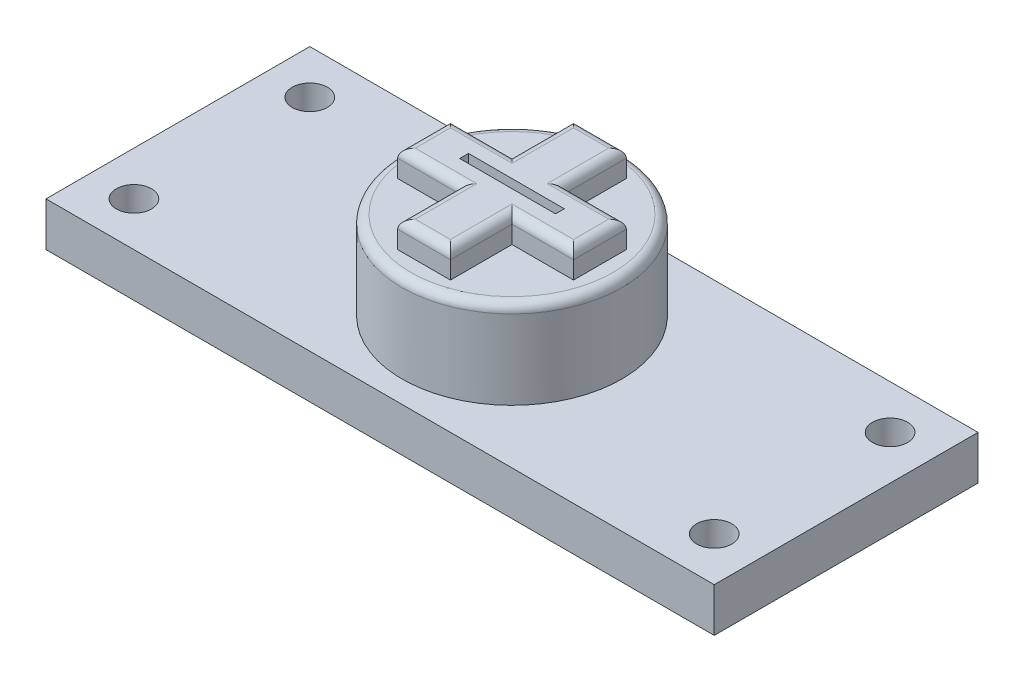
ISO-10303-21;
HEADER;
FILE_DESCRIPTION(('STEP AP214'),'2;1');
FILE_NAME('part.step','',(''),(''),'','','');
FILE_SCHEMA(('AUTOMOTIVE_DESIGN { 1 0 10303 214 1 1 1 1 }'));
ENDSEC;
DATA;
#1=APPLICATION_CONTEXT('core data for automotive mechanical design processes');
#2=APPLICATION_PROTOCOL_DEFINITION('international standard','automotive_design',2000,#1);
#3=PRODUCT_CONTEXT('',#1,'mechanical');
#4=PRODUCT('Part','Part','',(#3));
#5=PRODUCT_RELATED_PRODUCT_CATEGORY('part','',(#4));
#6=PRODUCT_DEFINITION_FORMATION('','',#4);
#7=PRODUCT_DEFINITION_CONTEXT('part definition',#1,'design');
#8=PRODUCT_DEFINITION('design','',#6,#7);
#9=PRODUCT_DEFINITION_SHAPE('','',#8);
#10=(LENGTH_UNIT() NAMED_UNIT(*) SI_UNIT(.MILLI.,.METRE.));
#11=(NAMED_UNIT(*) PLANE_ANGLE_UNIT() SI_UNIT($,.RADIAN.));
#12=(NAMED_UNIT(*) SI_UNIT($,.STERADIAN.) SOLID_ANGLE_UNIT());
#13=UNCERTAINTY_MEASURE_WITH_UNIT(LENGTH_MEASURE(1.E-05),#10,'distance_accuracy_value','');
#14=(GEOMETRIC_REPRESENTATION_CONTEXT(3) GLOBAL_UNCERTAINTY_ASSIGNED_CONTEXT((#13)) GLOBAL_UNIT_ASSIGNED_CONTEXT((#10,
#11,#12)) REPRESENTATION_CONTEXT('',''));
#15=CARTESIAN_POINT('',(0.,0.,0.));
#16=DIRECTION('',(0.,0.,1.));
#17=DIRECTION('',(1.,0.,0.));
#18=AXIS2_PLACEMENT_3D('',#15,#16,#17);
#19=CARTESIAN_POINT('',(-3800.,500.,-1500.));
#20=DIRECTION('',(0.,0.,-1.));
#21=DIRECTION('',(-1.,0.,0.));
#22=AXIS2_PLACEMENT_3D('',#19,#20,#21);
#23=PLANE('',#22);
#24=DIRECTION('',(1.,0.,0.));
#25=VECTOR('',#24,1.);
#26=CARTESIAN_POINT('',(-3800.,0.,-1500.));
#27=LINE('',#26,#25);
#28=CARTESIAN_POINT('',(-3800.,0.,-1500.));
#29=VERTEX_POINT('',#28);
#30=CARTESIAN_POINT('',(3800.,0.,-1500.));
#31=VERTEX_POINT('',#30);
#32=EDGE_CURVE('E339',#29,#31,#27,.T.);
#33=ORIENTED_EDGE('',*,*,#32,.F.);
#34=DIRECTION('',(0.,-1.,0.));
#35=VECTOR('',#34,1.);
#36=CARTESIAN_POINT('',(-3800.,500.,-1500.));
#37=LINE('',#36,#35);
#38=CARTESIAN_POINT('',(-3800.,500.,-1500.));
#39=VERTEX_POINT('',#38);
#40=EDGE_CURVE('E350',#39,#29,#37,.T.);
#41=ORIENTED_EDGE('',*,*,#40,.F.);
#42=DIRECTION('',(1.,0.,0.));
#43=VECTOR('',#42,1.);
#44=CARTESIAN_POINT('',(-3800.,500.,-1500.));
#45=LINE('',#44,#43);
#46=CARTESIAN_POINT('',(3800.,500.,-1500.));
#47=VERTEX_POINT('',#46);
#48=EDGE_CURVE('E327',#39,#47,#45,.T.);
#49=ORIENTED_EDGE('',*,*,#48,.T.);
#50=DIRECTION('',(0.,-1.,0.));
#51=VECTOR('',#50,1.);
#52=CARTESIAN_POINT('',(3800.,500.,-1500.));
#53=LINE('',#52,#51);
#54=EDGE_CURVE('E338',#47,#31,#53,.T.);
#55=ORIENTED_EDGE('',*,*,#54,.T.);
#56=EDGE_LOOP('',(#33,#41,#49,#55));
#57=FACE_BOUND('',#56,.T.);
#58=ADVANCED_FACE('F40',(#57),#23,.T.);
#59=CARTESIAN_POINT('',(-3800.,500.,-1500.));
#60=DIRECTION('',(1.,0.,0.));
#61=DIRECTION('',(0.,0.,-1.));
#62=AXIS2_PLACEMENT_3D('',#59,#60,#61);
#63=PLANE('',#62);
#64=DIRECTION('',(0.,0.,1.));
#65=VECTOR('',#64,1.);
#66=CARTESIAN_POINT('',(-3800.,0.,-1500.));
#67=LINE('',#66,#65);
#68=CARTESIAN_POINT('',(-3800.,0.,1500.));
#69=VERTEX_POINT('',#68);
#70=EDGE_CURVE('E331',#29,#69,#67,.T.);
#71=ORIENTED_EDGE('',*,*,#70,.T.);
#72=DIRECTION('',(0.,-1.,0.));
#73=VECTOR('',#72,1.);
#74=CARTESIAN_POINT('',(-3800.,500.,1500.));
#75=LINE('',#74,#73);
#76=CARTESIAN_POINT('',(-3800.,500.,1500.));
#77=VERTEX_POINT('',#76);
#78=EDGE_CURVE('E353',#77,#69,#75,.T.);
#79=ORIENTED_EDGE('',*,*,#78,.F.);
#80=DIRECTION('',(0.,0.,1.));
#81=VECTOR('',#80,1.);
#82=CARTESIAN_POINT('',(-3800.,500.,-1500.));
#83=LINE('',#82,#81);
#84=EDGE_CURVE('E336',#39,#77,#83,.T.);
#85=ORIENTED_EDGE('',*,*,#84,.F.);
#86=ORIENTED_EDGE('',*,*,#40,.T.);
#87=EDGE_LOOP('',(#71,#79,#85,#86));
#88=FACE_BOUND('',#87,.T.);
#89=ADVANCED_FACE('F471',(#88),#63,.F.);
#90=CARTESIAN_POINT('',(-3800.,500.,1500.));
#91=DIRECTION('',(0.,0.,-1.));
#92=DIRECTION('',(-1.,0.,0.));
#93=AXIS2_PLACEMENT_3D('',#90,#91,#92);
#94=PLANE('',#93);
#95=DIRECTION('',(1.,0.,0.));
#96=VECTOR('',#95,1.);
#97=CARTESIAN_POINT('',(-3800.,0.,1500.));
#98=LINE('',#97,#96);
#99=CARTESIAN_POINT('',(3800.,0.,1500.));
#100=VERTEX_POINT('',#99);
#101=EDGE_CURVE('E346',#69,#100,#98,.T.);
#102=ORIENTED_EDGE('',*,*,#101,.T.);
#103=DIRECTION('',(0.,-1.,0.));
#104=VECTOR('',#103,1.);
#105=CARTESIAN_POINT('',(3800.,500.,1500.));
#106=LINE('',#105,#104);
#107=CARTESIAN_POINT('',(3800.,500.,1500.));
#108=VERTEX_POINT('',#107);
#109=EDGE_CURVE('E356',#108,#100,#106,.T.);
#110=ORIENTED_EDGE('',*,*,#109,.F.);
#111=DIRECTION('',(1.,0.,0.));
#112=VECTOR('',#111,1.);
#113=CARTESIAN_POINT('',(-3800.,500.,1500.));
#114=LINE('',#113,#112);
#115=EDGE_CURVE('E334',#77,#108,#114,.T.);
#116=ORIENTED_EDGE('',*,*,#115,.F.);
#117=ORIENTED_EDGE('',*,*,#78,.T.);
#118=EDGE_LOOP('',(#102,#110,#116,#117));
#119=FACE_BOUND('',#118,.T.);
#120=ADVANCED_FACE('F477',(#119),#94,.F.);
#121=CARTESIAN_POINT('',(3800.,500.,-1500.));
#122=DIRECTION('',(1.,0.,0.));
#123=DIRECTION('',(0.,0.,-1.));
#124=AXIS2_PLACEMENT_3D('',#121,#122,#123);
#125=PLANE('',#124);
#126=DIRECTION('',(0.,0.,1.));
#127=VECTOR('',#126,1.);
#128=CARTESIAN_POINT('',(3800.,0.,-1500.));
#129=LINE('',#128,#127);
#130=EDGE_CURVE('E342',#31,#100,#129,.T.);
#131=ORIENTED_EDGE('',*,*,#130,.F.);
#132=ORIENTED_EDGE('',*,*,#54,.F.);
#133=DIRECTION('',(0.,0.,1.));
#134=VECTOR('',#133,1.);
#135=CARTESIAN_POINT('',(3800.,500.,-1500.));
#136=LINE('',#135,#134);
#137=EDGE_CURVE('E330',#47,#108,#136,.T.);
#138=ORIENTED_EDGE('',*,*,#137,.T.);
#139=ORIENTED_EDGE('',*,*,#109,.T.);
#140=EDGE_LOOP('',(#131,#132,#138,#139));
#141=FACE_BOUND('',#140,.T.);
#142=ADVANCED_FACE('F482',(#141),#125,.T.);
#143=CARTESIAN_POINT('',(0.,500.,0.));
#144=DIRECTION('',(0.,-1.,0.));
#145=DIRECTION('',(0.,0.,-1.));
#146=AXIS2_PLACEMENT_3D('',#143,#144,#145);
#147=PLANE('',#146);
#148=CARTESIAN_POINT('',(0.,500.,0.));
#149=DIRECTION('',(0.,-1.,0.));
#150=DIRECTION('',(0.,0.,-1.));
#151=AXIS2_PLACEMENT_3D('',#148,#149,#150);
#152=CIRCLE('',#151,1250.);
#153=CARTESIAN_POINT('',(0.,500.,-1250.));
#154=VERTEX_POINT('',#153);
#155=EDGE_CURVE('E352',#154,#154,#152,.F.);
#156=ORIENTED_EDGE('',*,*,#155,.F.);
#157=EDGE_LOOP('',(#156));
#158=FACE_BOUND('',#157,.T.);
#159=CARTESIAN_POINT('',(3300.,500.,1000.));
#160=DIRECTION('',(0.,1.,0.));
#161=DIRECTION('',(0.,0.,1.));
#162=AXIS2_PLACEMENT_3D('',#159,#160,#161);
#163=CIRCLE('',#162,200.);
#164=CARTESIAN_POINT('',(3300.,500.,1200.));
#165=VERTEX_POINT('',#164);
#166=EDGE_CURVE('E314',#165,#165,#163,.T.);
#167=ORIENTED_EDGE('',*,*,#166,.F.);
#168=EDGE_LOOP('',(#167));
#169=FACE_BOUND('',#168,.T.);
#170=CARTESIAN_POINT('',(3300.,500.,-1000.));
#171=DIRECTION('',(0.,1.,0.));
#172=DIRECTION('',(0.,0.,1.));
#173=AXIS2_PLACEMENT_3D('',#170,#171,#172);
#174=CIRCLE('',#173,200.);
#175=CARTESIAN_POINT('',(3300.,500.,-800.));
#176=VERTEX_POINT('',#175);
#177=EDGE_CURVE('E319',#176,#176,#174,.T.);
#178=ORIENTED_EDGE('',*,*,#177,.F.);
#179=EDGE_LOOP('',(#178));
#180=FACE_BOUND('',#179,.T.);
#181=CARTESIAN_POINT('',(-3300.,500.,-1000.));
#182=DIRECTION('',(0.,1.,0.));
#183=DIRECTION('',(0.,0.,1.));
#184=AXIS2_PLACEMENT_3D('',#181,#182,#183);
#185=CIRCLE('',#184,200.);
#186=CARTESIAN_POINT('',(-3300.,500.,-800.));
#187=VERTEX_POINT('',#186);
#188=EDGE_CURVE('E315',#187,#187,#185,.T.);
#189=ORIENTED_EDGE('',*,*,#188,.F.);
#190=EDGE_LOOP('',(#189));
#191=FACE_BOUND('',#190,.T.);
#192=CARTESIAN_POINT('',(-3300.,500.,1000.));
#193=DIRECTION('',(0.,1.,0.));
#194=DIRECTION('',(0.,0.,1.));
#195=AXIS2_PLACEMENT_3D('',#192,#193,#194);
#196=CIRCLE('',#195,200.);
#197=CARTESIAN_POINT('',(-3300.,500.,1200.));
#198=VERTEX_POINT('',#197);
#199=EDGE_CURVE('E318',#198,#198,#196,.T.);
#200=ORIENTED_EDGE('',*,*,#199,.F.);
#201=EDGE_LOOP('',(#200));
#202=FACE_BOUND('',#201,.T.);
#203=ORIENTED_EDGE('',*,*,#48,.F.);
#204=ORIENTED_EDGE('',*,*,#84,.T.);
#205=ORIENTED_EDGE('',*,*,#115,.T.);
#206=ORIENTED_EDGE('',*,*,#137,.F.);
#207=EDGE_LOOP('',(#203,#204,#205,#206));
#208=FACE_BOUND('',#207,.T.);
#209=ADVANCED_FACE('F652',(#158,#169,#180,#191,#202,#208),#147,.F.);
#210=CARTESIAN_POINT('',(0.,0.,0.));
#211=DIRECTION('',(0.,-1.,0.));
#212=DIRECTION('',(0.,0.,-1.));
#213=AXIS2_PLACEMENT_3D('',#210,#211,#212);
#214=PLANE('',#213);
#215=CARTESIAN_POINT('',(3300.,0.,1000.));
#216=DIRECTION('',(0.,-1.,0.));
#217=DIRECTION('',(0.,0.,-1.));
#218=AXIS2_PLACEMENT_3D('',#215,#216,#217);
#219=CIRCLE('',#218,200.);
#220=CARTESIAN_POINT('',(3300.,0.,800.));
#221=VERTEX_POINT('',#220);
#222=EDGE_CURVE('E343',#221,#221,#219,.T.);
#223=ORIENTED_EDGE('',*,*,#222,.F.);
#224=EDGE_LOOP('',(#223));
#225=FACE_BOUND('',#224,.T.);
#226=CARTESIAN_POINT('',(3300.,0.,-1000.));
#227=DIRECTION('',(0.,-1.,0.));
#228=DIRECTION('',(0.,0.,-1.));
#229=AXIS2_PLACEMENT_3D('',#226,#227,#228);
#230=CIRCLE('',#229,200.);
#231=CARTESIAN_POINT('',(3300.,0.,-1200.));
#232=VERTEX_POINT('',#231);
#233=EDGE_CURVE('E364',#232,#232,#230,.T.);
#234=ORIENTED_EDGE('',*,*,#233,.F.);
#235=EDGE_LOOP('',(#234));
#236=FACE_BOUND('',#235,.T.);
#237=CARTESIAN_POINT('',(-3300.,0.,-1000.));
#238=DIRECTION('',(0.,-1.,0.));
#239=DIRECTION('',(0.,0.,-1.));
#240=AXIS2_PLACEMENT_3D('',#237,#238,#239);
#241=CIRCLE('',#240,200.);
#242=CARTESIAN_POINT('',(-3300.,0.,-1200.));
#243=VERTEX_POINT('',#242);
#244=EDGE_CURVE('E361',#243,#243,#241,.T.);
#245=ORIENTED_EDGE('',*,*,#244,.F.);
#246=EDGE_LOOP('',(#245));
#247=FACE_BOUND('',#246,.T.);
#248=CARTESIAN_POINT('',(-3300.,0.,1000.));
#249=DIRECTION('',(0.,-1.,0.));
#250=DIRECTION('',(0.,0.,-1.));
#251=AXIS2_PLACEMENT_3D('',#248,#249,#250);
#252=CIRCLE('',#251,200.);
#253=CARTESIAN_POINT('',(-3300.,0.,800.));
#254=VERTEX_POINT('',#253);
#255=EDGE_CURVE('E326',#254,#254,#252,.T.);
#256=ORIENTED_EDGE('',*,*,#255,.F.);
#257=EDGE_LOOP('',(#256));
#258=FACE_BOUND('',#257,.T.);
#259=ORIENTED_EDGE('',*,*,#32,.T.);
#260=ORIENTED_EDGE('',*,*,#130,.T.);
#261=ORIENTED_EDGE('',*,*,#101,.F.);
#262=ORIENTED_EDGE('',*,*,#70,.F.);
#263=EDGE_LOOP('',(#259,#260,#261,#262));
#264=FACE_BOUND('',#263,.T.);
#265=ADVANCED_FACE('F650',(#225,#236,#247,#258,#264),#214,.T.);
#266=CARTESIAN_POINT('',(-3300.,-500.,1000.));
#267=DIRECTION('',(0.,1.,0.));
#268=DIRECTION('',(0.,0.,1.));
#269=AXIS2_PLACEMENT_3D('',#266,#267,#268);
#270=CYLINDRICAL_SURFACE('',#269,200.);
#271=ORIENTED_EDGE('',*,*,#255,.T.);
#272=EDGE_LOOP('',(#271));
#273=FACE_BOUND('',#272,.T.);
#274=ORIENTED_EDGE('',*,*,#199,.T.);
#275=EDGE_LOOP('',(#274));
#276=FACE_BOUND('',#275,.T.);
#277=ADVANCED_FACE('F640',(#273,#276),#270,.F.);
#278=CARTESIAN_POINT('',(-3300.,-500.,-1000.));
#279=DIRECTION('',(0.,1.,0.));
#280=DIRECTION('',(0.,0.,1.));
#281=AXIS2_PLACEMENT_3D('',#278,#279,#280);
#282=CYLINDRICAL_SURFACE('',#281,200.);
#283=ORIENTED_EDGE('',*,*,#244,.T.);
#284=EDGE_LOOP('',(#283));
#285=FACE_BOUND('',#284,.T.);
#286=ORIENTED_EDGE('',*,*,#188,.T.);
#287=EDGE_LOOP('',(#286));
#288=FACE_BOUND('',#287,.T.);
#289=ADVANCED_FACE('F636',(#285,#288),#282,.F.);
#290=CARTESIAN_POINT('',(3300.,-500.,-1000.));
#291=DIRECTION('',(0.,1.,0.));
#292=DIRECTION('',(0.,0.,1.));
#293=AXIS2_PLACEMENT_3D('',#290,#291,#292);
#294=CYLINDRICAL_SURFACE('',#293,200.);
#295=ORIENTED_EDGE('',*,*,#233,.T.);
#296=EDGE_LOOP('',(#295));
#297=FACE_BOUND('',#296,.T.);
#298=ORIENTED_EDGE('',*,*,#177,.T.);
#299=EDGE_LOOP('',(#298));
#300=FACE_BOUND('',#299,.T.);
#301=ADVANCED_FACE('F639',(#297,#300),#294,.F.);
#302=CARTESIAN_POINT('',(3300.,-500.,1000.));
#303=DIRECTION('',(0.,1.,0.));
#304=DIRECTION('',(0.,0.,1.));
#305=AXIS2_PLACEMENT_3D('',#302,#303,#304);
#306=CYLINDRICAL_SURFACE('',#305,200.);
#307=ORIENTED_EDGE('',*,*,#222,.T.);
#308=EDGE_LOOP('',(#307));
#309=FACE_BOUND('',#308,.T.);
#310=ORIENTED_EDGE('',*,*,#166,.T.);
#311=EDGE_LOOP('',(#310));
#312=FACE_BOUND('',#311,.T.);
#313=ADVANCED_FACE('F634',(#309,#312),#306,.F.);
#314=CARTESIAN_POINT('',(0.,1500.,0.));
#315=DIRECTION('',(0.,-1.,0.));
#316=DIRECTION('',(0.,0.,-1.));
#317=AXIS2_PLACEMENT_3D('',#314,#315,#316);
#318=CYLINDRICAL_SURFACE('',#317,1250.);
#319=CARTESIAN_POINT('',(0.,1400.,0.));
#320=DIRECTION('',(0.,1.,0.));
#321=DIRECTION('',(0.,0.,1.));
#322=AXIS2_PLACEMENT_3D('',#319,#320,#321);
#323=CIRCLE('',#322,1250.);
#324=CARTESIAN_POINT('',(0.,1400.,1250.));
#325=VERTEX_POINT('',#324);
#326=EDGE_CURVE('E11',#325,#325,#323,.F.);
#327=ORIENTED_EDGE('',*,*,#326,.T.);
#328=EDGE_LOOP('',(#327));
#329=FACE_BOUND('',#328,.T.);
#330=ORIENTED_EDGE('',*,*,#155,.T.);
#331=EDGE_LOOP('',(#330));
#332=FACE_BOUND('',#331,.T.);
#333=ADVANCED_FACE('F631',(#329,#332),#318,.T.);
#334=CARTESIAN_POINT('',(0.,1500.,0.));
#335=DIRECTION('',(0.,1.,0.));
#336=DIRECTION('',(0.,0.,1.));
#337=AXIS2_PLACEMENT_3D('',#334,#335,#336);
#338=PLANE('',#337);
#339=CARTESIAN_POINT('',(0.,1500.,0.));
#340=DIRECTION('',(0.,1.,0.));
#341=DIRECTION('',(0.,0.,1.));
#342=AXIS2_PLACEMENT_3D('',#339,#340,#341);
#343=CIRCLE('',#342,1150.);
#344=CARTESIAN_POINT('',(0.,1500.,1150.));
#345=VERTEX_POINT('',#344);
#346=EDGE_CURVE('E48',#345,#345,#343,.T.);
#347=ORIENTED_EDGE('',*,*,#346,.T.);
#348=EDGE_LOOP('',(#347));
#349=FACE_BOUND('',#348,.T.);
#350=DIRECTION('',(0.,0.,-1.));
#351=VECTOR('',#350,1.);
#352=CARTESIAN_POINT('',(300.,1500.,300.));
#353=LINE('',#352,#351);
#354=CARTESIAN_POINT('',(300.,1500.,1000.));
#355=VERTEX_POINT('',#354);
#356=CARTESIAN_POINT('',(300.,1500.,300.));
#357=VERTEX_POINT('',#356);
#358=EDGE_CURVE('E253',#355,#357,#353,.T.);
#359=ORIENTED_EDGE('',*,*,#358,.F.);
#360=DIRECTION('',(1.,0.,0.));
#361=VECTOR('',#360,1.);
#362=CARTESIAN_POINT('',(-300.,1500.,1000.));
#363=LINE('',#362,#361);
#364=CARTESIAN_POINT('',(-300.,1500.,1000.));
#365=VERTEX_POINT('',#364);
#366=EDGE_CURVE('E287',#365,#355,#363,.T.);
#367=ORIENTED_EDGE('',*,*,#366,.F.);
#368=DIRECTION('',(0.,0.,1.));
#369=VECTOR('',#368,1.);
#370=CARTESIAN_POINT('',(-300.,1500.,300.));
#371=LINE('',#370,#369);
#372=CARTESIAN_POINT('',(-300.,1500.,300.));
#373=VERTEX_POINT('',#372);
#374=EDGE_CURVE('E284',#373,#365,#371,.T.);
#375=ORIENTED_EDGE('',*,*,#374,.F.);
#376=DIRECTION('',(1.,0.,0.));
#377=VECTOR('',#376,1.);
#378=CARTESIAN_POINT('',(-300.,1500.,300.));
#379=LINE('',#378,#377);
#380=CARTESIAN_POINT('',(-1000.,1500.,300.000000000001));
#381=VERTEX_POINT('',#380);
#382=EDGE_CURVE('E281',#381,#373,#379,.T.);
#383=ORIENTED_EDGE('',*,*,#382,.F.);
#384=DIRECTION('',(0.,0.,1.));
#385=VECTOR('',#384,1.);
#386=CARTESIAN_POINT('',(-1000.,1500.,300.000000000001));
#387=LINE('',#386,#385);
#388=CARTESIAN_POINT('',(-1000.,1500.,-300.));
#389=VERTEX_POINT('',#388);
#390=EDGE_CURVE('E278',#389,#381,#387,.T.);
#391=ORIENTED_EDGE('',*,*,#390,.F.);
#392=DIRECTION('',(-1.,0.,0.));
#393=VECTOR('',#392,1.);
#394=CARTESIAN_POINT('',(-300.,1500.,-300.));
#395=LINE('',#394,#393);
#396=CARTESIAN_POINT('',(-300.,1500.,-300.));
#397=VERTEX_POINT('',#396);
#398=EDGE_CURVE('E275',#397,#389,#395,.T.);
#399=ORIENTED_EDGE('',*,*,#398,.F.);
#400=DIRECTION('',(0.,0.,1.));
#401=VECTOR('',#400,1.);
#402=CARTESIAN_POINT('',(-300.,1500.,-1000.));
#403=LINE('',#402,#401);
#404=CARTESIAN_POINT('',(-300.,1500.,-1000.));
#405=VERTEX_POINT('',#404);
#406=EDGE_CURVE('E272',#405,#397,#403,.T.);
#407=ORIENTED_EDGE('',*,*,#406,.F.);
#408=DIRECTION('',(-1.,0.,0.));
#409=VECTOR('',#408,1.);
#410=CARTESIAN_POINT('',(-300.,1500.,-1000.));
#411=LINE('',#410,#409);
#412=CARTESIAN_POINT('',(300.,1500.,-1000.));
#413=VERTEX_POINT('',#412);
#414=EDGE_CURVE('E269',#413,#405,#411,.T.);
#415=ORIENTED_EDGE('',*,*,#414,.F.);
#416=DIRECTION('',(0.,0.,-1.));
#417=VECTOR('',#416,1.);
#418=CARTESIAN_POINT('',(300.,1500.,-1000.));
#419=LINE('',#418,#417);
#420=CARTESIAN_POINT('',(300.,1500.,-300.));
#421=VERTEX_POINT('',#420);
#422=EDGE_CURVE('E266',#421,#413,#419,.T.);
#423=ORIENTED_EDGE('',*,*,#422,.F.);
#424=DIRECTION('',(-1.,0.,0.));
#425=VECTOR('',#424,1.);
#426=CARTESIAN_POINT('',(1000.,1500.,-300.));
#427=LINE('',#426,#425);
#428=CARTESIAN_POINT('',(1000.,1500.,-300.));
#429=VERTEX_POINT('',#428);
#430=EDGE_CURVE('E263',#429,#421,#427,.T.);
#431=ORIENTED_EDGE('',*,*,#430,.F.);
#432=DIRECTION('',(0.,0.,-1.));
#433=VECTOR('',#432,1.);
#434=CARTESIAN_POINT('',(1000.,1500.,300.));
#435=LINE('',#434,#433);
#436=CARTESIAN_POINT('',(1000.,1500.,300.));
#437=VERTEX_POINT('',#436);
#438=EDGE_CURVE('E260',#437,#429,#435,.T.);
#439=ORIENTED_EDGE('',*,*,#438,.F.);
#440=DIRECTION('',(1.,0.,0.));
#441=VECTOR('',#440,1.);
#442=CARTESIAN_POINT('',(1000.,1500.,300.));
#443=LINE('',#442,#441);
#444=EDGE_CURVE('E256',#357,#437,#443,.T.);
#445=ORIENTED_EDGE('',*,*,#444,.F.);
#446=EDGE_LOOP('',(#359,#367,#375,#383,#391,#399,#407,#415,#423,#431,#439,#445));
#447=FACE_BOUND('',#446,.T.);
#448=ADVANCED_FACE('F454',(#349,#447),#338,.T.);
#449=CARTESIAN_POINT('',(300.,1800.,300.));
#450=DIRECTION('',(-1.,0.,0.));
#451=DIRECTION('',(0.,0.,1.));
#452=AXIS2_PLACEMENT_3D('',#449,#450,#451);
#453=PLANE('',#452);
#454=DIRECTION('',(0.,-1.,0.));
#455=VECTOR('',#454,1.);
#456=CARTESIAN_POINT('',(300.,1800.,300.));
#457=LINE('',#456,#455);
#458=CARTESIAN_POINT('',(300.,1700.,300.));
#459=VERTEX_POINT('',#458);
#460=EDGE_CURVE('E312',#459,#357,#457,.T.);
#461=ORIENTED_EDGE('',*,*,#460,.F.);
#462=DIRECTION('',(0.,0.,-1.));
#463=VECTOR('',#462,1.);
#464=CARTESIAN_POINT('',(300.,1700.,1000.));
#465=LINE('',#464,#463);
#466=CARTESIAN_POINT('',(300.,1700.,1000.));
#467=VERTEX_POINT('',#466);
#468=EDGE_CURVE('E418',#459,#467,#465,.F.);
#469=ORIENTED_EDGE('',*,*,#468,.T.);
#470=DIRECTION('',(0.,-1.,0.));
#471=VECTOR('',#470,1.);
#472=CARTESIAN_POINT('',(300.,1800.,1000.));
#473=LINE('',#472,#471);
#474=EDGE_CURVE('E290',#467,#355,#473,.T.);
#475=ORIENTED_EDGE('',*,*,#474,.T.);
#476=ORIENTED_EDGE('',*,*,#358,.T.);
#477=EDGE_LOOP('',(#461,#469,#475,#476));
#478=FACE_BOUND('',#477,.T.);
#479=ADVANCED_FACE('F568',(#478),#453,.F.);
#480=CARTESIAN_POINT('',(1000.,1800.,300.));
#481=DIRECTION('',(0.,0.,-1.));
#482=DIRECTION('',(-1.,0.,0.));
#483=AXIS2_PLACEMENT_3D('',#480,#481,#482);
#484=PLANE('',#483);
#485=DIRECTION('',(0.,-1.,0.));
#486=VECTOR('',#485,1.);
#487=CARTESIAN_POINT('',(1000.,1800.,300.));
#488=LINE('',#487,#486);
#489=CARTESIAN_POINT('',(1000.,1700.,300.));
#490=VERTEX_POINT('',#489);
#491=EDGE_CURVE('E310',#490,#437,#488,.T.);
#492=ORIENTED_EDGE('',*,*,#491,.F.);
#493=DIRECTION('',(1.,0.,0.));
#494=VECTOR('',#493,1.);
#495=CARTESIAN_POINT('',(300.,1700.,300.));
#496=LINE('',#495,#494);
#497=EDGE_CURVE('E63',#490,#459,#496,.F.);
#498=ORIENTED_EDGE('',*,*,#497,.T.);
#499=ORIENTED_EDGE('',*,*,#460,.T.);
#500=ORIENTED_EDGE('',*,*,#444,.T.);
#501=EDGE_LOOP('',(#492,#498,#499,#500));
#502=FACE_BOUND('',#501,.T.);
#503=ADVANCED_FACE('F559',(#502),#484,.F.);
#504=CARTESIAN_POINT('',(1000.,1800.,300.));
#505=DIRECTION('',(-1.,0.,0.));
#506=DIRECTION('',(0.,0.,1.));
#507=AXIS2_PLACEMENT_3D('',#504,#505,#506);
#508=PLANE('',#507);
#509=DIRECTION('',(0.,-1.,0.));
#510=VECTOR('',#509,1.);
#511=CARTESIAN_POINT('',(1000.,1800.,-300.));
#512=LINE('',#511,#510);
#513=CARTESIAN_POINT('',(1000.,1700.,-300.));
#514=VERTEX_POINT('',#513);
#515=EDGE_CURVE('E308',#514,#429,#512,.T.);
#516=ORIENTED_EDGE('',*,*,#515,.F.);
#517=DIRECTION('',(0.,0.,-1.));
#518=VECTOR('',#517,1.);
#519=CARTESIAN_POINT('',(1000.,1700.,300.));
#520=LINE('',#519,#518);
#521=EDGE_CURVE('E415',#514,#490,#520,.F.);
#522=ORIENTED_EDGE('',*,*,#521,.T.);
#523=ORIENTED_EDGE('',*,*,#491,.T.);
#524=ORIENTED_EDGE('',*,*,#438,.T.);
#525=EDGE_LOOP('',(#516,#522,#523,#524));
#526=FACE_BOUND('',#525,.T.);
#527=ADVANCED_FACE('F555',(#526),#508,.F.);
#528=CARTESIAN_POINT('',(1000.,1800.,-300.));
#529=DIRECTION('',(0.,0.,1.));
#530=DIRECTION('',(1.,0.,0.));
#531=AXIS2_PLACEMENT_3D('',#528,#529,#530);
#532=PLANE('',#531);
#533=DIRECTION('',(0.,-1.,0.));
#534=VECTOR('',#533,1.);
#535=CARTESIAN_POINT('',(300.,1800.,-300.));
#536=LINE('',#535,#534);
#537=CARTESIAN_POINT('',(300.,1700.,-300.));
#538=VERTEX_POINT('',#537);
#539=EDGE_CURVE('E306',#538,#421,#536,.T.);
#540=ORIENTED_EDGE('',*,*,#539,.F.);
#541=DIRECTION('',(-1.,0.,0.));
#542=VECTOR('',#541,1.);
#543=CARTESIAN_POINT('',(1000.,1700.,-300.));
#544=LINE('',#543,#542);
#545=EDGE_CURVE('E413',#538,#514,#544,.F.);
#546=ORIENTED_EDGE('',*,*,#545,.T.);
#547=ORIENTED_EDGE('',*,*,#515,.T.);
#548=ORIENTED_EDGE('',*,*,#430,.T.);
#549=EDGE_LOOP('',(#540,#546,#547,#548));
#550=FACE_BOUND('',#549,.T.);
#551=ADVANCED_FACE('F547',(#550),#532,.F.);
#552=CARTESIAN_POINT('',(300.,1800.,-1000.));
#553=DIRECTION('',(-1.,0.,0.));
#554=DIRECTION('',(0.,0.,1.));
#555=AXIS2_PLACEMENT_3D('',#552,#553,#554);
#556=PLANE('',#555);
#557=DIRECTION('',(0.,-1.,0.));
#558=VECTOR('',#557,1.);
#559=CARTESIAN_POINT('',(300.,1800.,-1000.));
#560=LINE('',#559,#558);
#561=CARTESIAN_POINT('',(300.,1700.,-1000.));
#562=VERTEX_POINT('',#561);
#563=EDGE_CURVE('E304',#562,#413,#560,.T.);
#564=ORIENTED_EDGE('',*,*,#563,.F.);
#565=DIRECTION('',(0.,0.,-1.));
#566=VECTOR('',#565,1.);
#567=CARTESIAN_POINT('',(300.,1700.,-300.));
#568=LINE('',#567,#566);
#569=EDGE_CURVE('E411',#562,#538,#568,.F.);
#570=ORIENTED_EDGE('',*,*,#569,.T.);
#571=ORIENTED_EDGE('',*,*,#539,.T.);
#572=ORIENTED_EDGE('',*,*,#422,.T.);
#573=EDGE_LOOP('',(#564,#570,#571,#572));
#574=FACE_BOUND('',#573,.T.);
#575=ADVANCED_FACE('F544',(#574),#556,.F.);
#576=CARTESIAN_POINT('',(-300.,1800.,-1000.));
#577=DIRECTION('',(0.,0.,1.));
#578=DIRECTION('',(1.,0.,0.));
#579=AXIS2_PLACEMENT_3D('',#576,#577,#578);
#580=PLANE('',#579);
#581=DIRECTION('',(0.,-1.,0.));
#582=VECTOR('',#581,1.);
#583=CARTESIAN_POINT('',(-300.,1800.,-1000.));
#584=LINE('',#583,#582);
#585=CARTESIAN_POINT('',(-300.,1700.,-1000.));
#586=VERTEX_POINT('',#585);
#587=EDGE_CURVE('E302',#586,#405,#584,.T.);
#588=ORIENTED_EDGE('',*,*,#587,.F.);
#589=DIRECTION('',(-1.,0.,0.));
#590=VECTOR('',#589,1.);
#591=CARTESIAN_POINT('',(300.,1700.,-1000.));
#592=LINE('',#591,#590);
#593=EDGE_CURVE('E409',#586,#562,#592,.F.);
#594=ORIENTED_EDGE('',*,*,#593,.T.);
#595=ORIENTED_EDGE('',*,*,#563,.T.);
#596=ORIENTED_EDGE('',*,*,#414,.T.);
#597=EDGE_LOOP('',(#588,#594,#595,#596));
#598=FACE_BOUND('',#597,.T.);
#599=ADVANCED_FACE('F610',(#598),#580,.F.);
#600=CARTESIAN_POINT('',(-300.,1800.,-1000.));
#601=DIRECTION('',(1.,0.,0.));
#602=DIRECTION('',(0.,0.,-1.));
#603=AXIS2_PLACEMENT_3D('',#600,#601,#602);
#604=PLANE('',#603);
#605=DIRECTION('',(0.,-1.,0.));
#606=VECTOR('',#605,1.);
#607=CARTESIAN_POINT('',(-300.,1800.,-300.));
#608=LINE('',#607,#606);
#609=CARTESIAN_POINT('',(-300.,1700.,-300.));
#610=VERTEX_POINT('',#609);
#611=EDGE_CURVE('E300',#610,#397,#608,.T.);
#612=ORIENTED_EDGE('',*,*,#611,.F.);
#613=DIRECTION('',(0.,0.,1.));
#614=VECTOR('',#613,1.);
#615=CARTESIAN_POINT('',(-300.,1700.,-1000.));
#616=LINE('',#615,#614);
#617=EDGE_CURVE('E407',#610,#586,#616,.F.);
#618=ORIENTED_EDGE('',*,*,#617,.T.);
#619=ORIENTED_EDGE('',*,*,#587,.T.);
#620=ORIENTED_EDGE('',*,*,#406,.T.);
#621=EDGE_LOOP('',(#612,#618,#619,#620));
#622=FACE_BOUND('',#621,.T.);
#623=ADVANCED_FACE('F607',(#622),#604,.F.);
#624=CARTESIAN_POINT('',(-300.,1800.,-300.));
#625=DIRECTION('',(0.,0.,1.));
#626=DIRECTION('',(1.,0.,0.));
#627=AXIS2_PLACEMENT_3D('',#624,#625,#626);
#628=PLANE('',#627);
#629=DIRECTION('',(0.,-1.,0.));
#630=VECTOR('',#629,1.);
#631=CARTESIAN_POINT('',(-1000.,1800.,-300.));
#632=LINE('',#631,#630);
#633=CARTESIAN_POINT('',(-1000.,1700.,-300.));
#634=VERTEX_POINT('',#633);
#635=EDGE_CURVE('E298',#634,#389,#632,.T.);
#636=ORIENTED_EDGE('',*,*,#635,.F.);
#637=DIRECTION('',(-1.,0.,0.));
#638=VECTOR('',#637,1.);
#639=CARTESIAN_POINT('',(-300.,1700.,-300.));
#640=LINE('',#639,#638);
#641=EDGE_CURVE('E405',#634,#610,#640,.F.);
#642=ORIENTED_EDGE('',*,*,#641,.T.);
#643=ORIENTED_EDGE('',*,*,#611,.T.);
#644=ORIENTED_EDGE('',*,*,#398,.T.);
#645=EDGE_LOOP('',(#636,#642,#643,#644));
#646=FACE_BOUND('',#645,.T.);
#647=ADVANCED_FACE('F598',(#646),#628,.F.);
#648=CARTESIAN_POINT('',(-1000.,1800.,300.000000000001));
#649=DIRECTION('',(1.,0.,0.));
#650=DIRECTION('',(0.,0.,-1.));
#651=AXIS2_PLACEMENT_3D('',#648,#649,#650);
#652=PLANE('',#651);
#653=DIRECTION('',(0.,-1.,0.));
#654=VECTOR('',#653,1.);
#655=CARTESIAN_POINT('',(-1000.,1800.,300.000000000001));
#656=LINE('',#655,#654);
#657=CARTESIAN_POINT('',(-1000.,1700.,300.000000000001));
#658=VERTEX_POINT('',#657);
#659=EDGE_CURVE('E296',#658,#381,#656,.T.);
#660=ORIENTED_EDGE('',*,*,#659,.F.);
#661=DIRECTION('',(0.,0.,1.));
#662=VECTOR('',#661,1.);
#663=CARTESIAN_POINT('',(-1000.,1700.,-300.));
#664=LINE('',#663,#662);
#665=EDGE_CURVE('E403',#658,#634,#664,.F.);
#666=ORIENTED_EDGE('',*,*,#665,.T.);
#667=ORIENTED_EDGE('',*,*,#635,.T.);
#668=ORIENTED_EDGE('',*,*,#390,.T.);
#669=EDGE_LOOP('',(#660,#666,#667,#668));
#670=FACE_BOUND('',#669,.T.);
#671=ADVANCED_FACE('F594',(#670),#652,.F.);
#672=CARTESIAN_POINT('',(-300.,1800.,300.));
#673=DIRECTION('',(0.,0.,-1.));
#674=DIRECTION('',(-1.,0.,0.));
#675=AXIS2_PLACEMENT_3D('',#672,#673,#674);
#676=PLANE('',#675);
#677=DIRECTION('',(0.,-1.,0.));
#678=VECTOR('',#677,1.);
#679=CARTESIAN_POINT('',(-300.,1800.,300.));
#680=LINE('',#679,#678);
#681=CARTESIAN_POINT('',(-300.,1700.,300.));
#682=VERTEX_POINT('',#681);
#683=EDGE_CURVE('E294',#682,#373,#680,.T.);
#684=ORIENTED_EDGE('',*,*,#683,.F.);
#685=DIRECTION('',(1.,0.,0.));
#686=VECTOR('',#685,1.);
#687=CARTESIAN_POINT('',(-1000.,1700.,300.000000000001));
#688=LINE('',#687,#686);
#689=EDGE_CURVE('E401',#682,#658,#688,.F.);
#690=ORIENTED_EDGE('',*,*,#689,.T.);
#691=ORIENTED_EDGE('',*,*,#659,.T.);
#692=ORIENTED_EDGE('',*,*,#382,.T.);
#693=EDGE_LOOP('',(#684,#690,#691,#692));
#694=FACE_BOUND('',#693,.T.);
#695=ADVANCED_FACE('F584',(#694),#676,.F.);
#696=CARTESIAN_POINT('',(-300.,1800.,300.));
#697=DIRECTION('',(1.,0.,0.));
#698=DIRECTION('',(0.,0.,-1.));
#699=AXIS2_PLACEMENT_3D('',#696,#697,#698);
#700=PLANE('',#699);
#701=DIRECTION('',(0.,-1.,0.));
#702=VECTOR('',#701,1.);
#703=CARTESIAN_POINT('',(-300.,1800.,1000.));
#704=LINE('',#703,#702);
#705=CARTESIAN_POINT('',(-300.,1700.,1000.));
#706=VERTEX_POINT('',#705);
#707=EDGE_CURVE('E292',#706,#365,#704,.T.);
#708=ORIENTED_EDGE('',*,*,#707,.F.);
#709=DIRECTION('',(0.,0.,1.));
#710=VECTOR('',#709,1.);
#711=CARTESIAN_POINT('',(-300.,1700.,300.));
#712=LINE('',#711,#710);
#713=EDGE_CURVE('E399',#706,#682,#712,.F.);
#714=ORIENTED_EDGE('',*,*,#713,.T.);
#715=ORIENTED_EDGE('',*,*,#683,.T.);
#716=ORIENTED_EDGE('',*,*,#374,.T.);
#717=EDGE_LOOP('',(#708,#714,#715,#716));
#718=FACE_BOUND('',#717,.T.);
#719=ADVANCED_FACE('F580',(#718),#700,.F.);
#720=CARTESIAN_POINT('',(-300.,1800.,1000.));
#721=DIRECTION('',(0.,0.,-1.));
#722=DIRECTION('',(-1.,0.,0.));
#723=AXIS2_PLACEMENT_3D('',#720,#721,#722);
#724=PLANE('',#723);
#725=ORIENTED_EDGE('',*,*,#474,.F.);
#726=DIRECTION('',(1.,0.,0.));
#727=VECTOR('',#726,1.);
#728=CARTESIAN_POINT('',(-300.,1700.,1000.));
#729=LINE('',#728,#727);
#730=EDGE_CURVE('E396',#467,#706,#729,.F.);
#731=ORIENTED_EDGE('',*,*,#730,.T.);
#732=ORIENTED_EDGE('',*,*,#707,.T.);
#733=ORIENTED_EDGE('',*,*,#366,.T.);
#734=EDGE_LOOP('',(#725,#731,#732,#733));
#735=FACE_BOUND('',#734,.T.);
#736=ADVANCED_FACE('F530',(#735),#724,.F.);
#737=CARTESIAN_POINT('',(0.,1800.,0.));
#738=DIRECTION('',(0.,1.,0.));
#739=DIRECTION('',(0.,0.,1.));
#740=AXIS2_PLACEMENT_3D('',#737,#738,#739);
#741=PLANE('',#740);
#742=DIRECTION('',(0.,0.,-1.));
#743=VECTOR('',#742,1.);
#744=CARTESIAN_POINT('',(545.25,1800.,-50.));
#745=LINE('',#744,#743);
#746=CARTESIAN_POINT('',(545.25,1800.,50.));
#747=VERTEX_POINT('',#746);
#748=CARTESIAN_POINT('',(545.25,1800.,-50.));
#749=VERTEX_POINT('',#748);
#750=EDGE_CURVE('E55',#747,#749,#745,.T.);
#751=ORIENTED_EDGE('',*,*,#750,.F.);
#752=DIRECTION('',(1.,0.,0.));
#753=VECTOR('',#752,1.);
#754=CARTESIAN_POINT('',(-545.25,1800.,50.));
#755=LINE('',#754,#753);
#756=CARTESIAN_POINT('',(-545.25,1800.,50.));
#757=VERTEX_POINT('',#756);
#758=EDGE_CURVE('E234',#757,#747,#755,.T.);
#759=ORIENTED_EDGE('',*,*,#758,.F.);
#760=DIRECTION('',(0.,0.,1.));
#761=VECTOR('',#760,1.);
#762=CARTESIAN_POINT('',(-545.25,1800.,-50.));
#763=LINE('',#762,#761);
#764=CARTESIAN_POINT('',(-545.25,1800.,-50.));
#765=VERTEX_POINT('',#764);
#766=EDGE_CURVE('E237',#765,#757,#763,.T.);
#767=ORIENTED_EDGE('',*,*,#766,.F.);
#768=DIRECTION('',(-1.,0.,0.));
#769=VECTOR('',#768,1.);
#770=CARTESIAN_POINT('',(-545.25,1800.,-50.));
#771=LINE('',#770,#769);
#772=EDGE_CURVE('E243',#749,#765,#771,.T.);
#773=ORIENTED_EDGE('',*,*,#772,.F.);
#774=EDGE_LOOP('',(#751,#759,#767,#773));
#775=FACE_BOUND('',#774,.T.);
#776=DIRECTION('',(0.,0.,1.));
#777=VECTOR('',#776,1.);
#778=CARTESIAN_POINT('',(-200.,1800.,1000.));
#779=LINE('',#778,#777);
#780=CARTESIAN_POINT('',(-200.,1800.,200.));
#781=VERTEX_POINT('',#780);
#782=CARTESIAN_POINT('',(-200.,1800.,900.));
#783=VERTEX_POINT('',#782);
#784=EDGE_CURVE('E391',#781,#783,#779,.T.);
#785=ORIENTED_EDGE('',*,*,#784,.T.);
#786=DIRECTION('',(1.,0.,0.));
#787=VECTOR('',#786,1.);
#788=CARTESIAN_POINT('',(300.,1800.,900.));
#789=LINE('',#788,#787);
#790=CARTESIAN_POINT('',(200.,1800.,900.));
#791=VERTEX_POINT('',#790);
#792=EDGE_CURVE('E393',#783,#791,#789,.T.);
#793=ORIENTED_EDGE('',*,*,#792,.T.);
#794=DIRECTION('',(0.,0.,-1.));
#795=VECTOR('',#794,1.);
#796=CARTESIAN_POINT('',(200.,1800.,300.));
#797=LINE('',#796,#795);
#798=CARTESIAN_POINT('',(200.,1800.,200.));
#799=VERTEX_POINT('',#798);
#800=EDGE_CURVE('E371',#791,#799,#797,.T.);
#801=ORIENTED_EDGE('',*,*,#800,.T.);
#802=DIRECTION('',(1.,0.,0.));
#803=VECTOR('',#802,1.);
#804=CARTESIAN_POINT('',(1000.,1800.,200.));
#805=LINE('',#804,#803);
#806=CARTESIAN_POINT('',(900.,1800.,200.));
#807=VERTEX_POINT('',#806);
#808=EDGE_CURVE('E373',#799,#807,#805,.T.);
#809=ORIENTED_EDGE('',*,*,#808,.T.);
#810=DIRECTION('',(0.,0.,-1.));
#811=VECTOR('',#810,1.);
#812=CARTESIAN_POINT('',(900.,1800.,-300.));
#813=LINE('',#812,#811);
#814=CARTESIAN_POINT('',(900.,1800.,-200.));
#815=VERTEX_POINT('',#814);
#816=EDGE_CURVE('E375',#807,#815,#813,.T.);
#817=ORIENTED_EDGE('',*,*,#816,.T.);
#818=DIRECTION('',(-1.,0.,0.));
#819=VECTOR('',#818,1.);
#820=CARTESIAN_POINT('',(300.,1800.,-200.));
#821=LINE('',#820,#819);
#822=CARTESIAN_POINT('',(200.,1800.,-200.));
#823=VERTEX_POINT('',#822);
#824=EDGE_CURVE('E377',#815,#823,#821,.T.);
#825=ORIENTED_EDGE('',*,*,#824,.T.);
#826=DIRECTION('',(0.,0.,-1.));
#827=VECTOR('',#826,1.);
#828=CARTESIAN_POINT('',(200.,1800.,-1000.));
#829=LINE('',#828,#827);
#830=CARTESIAN_POINT('',(200.,1800.,-900.));
#831=VERTEX_POINT('',#830);
#832=EDGE_CURVE('E379',#823,#831,#829,.T.);
#833=ORIENTED_EDGE('',*,*,#832,.T.);
#834=DIRECTION('',(-1.,0.,0.));
#835=VECTOR('',#834,1.);
#836=CARTESIAN_POINT('',(-300.,1800.,-900.));
#837=LINE('',#836,#835);
#838=CARTESIAN_POINT('',(-200.,1800.,-900.));
#839=VERTEX_POINT('',#838);
#840=EDGE_CURVE('E381',#831,#839,#837,.T.);
#841=ORIENTED_EDGE('',*,*,#840,.T.);
#842=DIRECTION('',(0.,0.,1.));
#843=VECTOR('',#842,1.);
#844=CARTESIAN_POINT('',(-200.,1800.,-300.));
#845=LINE('',#844,#843);
#846=CARTESIAN_POINT('',(-200.,1800.,-200.));
#847=VERTEX_POINT('',#846);
#848=EDGE_CURVE('E383',#839,#847,#845,.T.);
#849=ORIENTED_EDGE('',*,*,#848,.T.);
#850=DIRECTION('',(-1.,0.,0.));
#851=VECTOR('',#850,1.);
#852=CARTESIAN_POINT('',(-1000.,1800.,-200.));
#853=LINE('',#852,#851);
#854=CARTESIAN_POINT('',(-900.,1800.,-200.));
#855=VERTEX_POINT('',#854);
#856=EDGE_CURVE('E385',#847,#855,#853,.T.);
#857=ORIENTED_EDGE('',*,*,#856,.T.);
#858=DIRECTION('',(0.,0.,1.));
#859=VECTOR('',#858,1.);
#860=CARTESIAN_POINT('',(-900.,1800.,300.000000000001));
#861=LINE('',#860,#859);
#862=CARTESIAN_POINT('',(-900.,1800.,200.));
#863=VERTEX_POINT('',#862);
#864=EDGE_CURVE('E387',#855,#863,#861,.T.);
#865=ORIENTED_EDGE('',*,*,#864,.T.);
#866=DIRECTION('',(1.,0.,0.));
#867=VECTOR('',#866,1.);
#868=CARTESIAN_POINT('',(-300.,1800.,200.));
#869=LINE('',#868,#867);
#870=EDGE_CURVE('E389',#863,#781,#869,.T.);
#871=ORIENTED_EDGE('',*,*,#870,.T.);
#872=EDGE_LOOP('',(#785,#793,#801,#809,#817,#825,#833,#841,#849,#857,#865,#871));
#873=FACE_BOUND('',#872,.T.);
#874=ADVANCED_FACE('F525',(#775,#873),#741,.T.);
#875=CARTESIAN_POINT('',(0.,1700.,-900.));
#876=DIRECTION('',(1.,0.,0.));
#877=DIRECTION('',(0.,0.,-1.));
#878=AXIS2_PLACEMENT_3D('',#875,#876,#877);
#879=CYLINDRICAL_SURFACE('',#878,100.);
#880=CARTESIAN_POINT('',(200.,1700.,-900.));
#881=DIRECTION('',(0.707106781186547,0.,0.707106781186547));
#882=DIRECTION('',(-0.707106781186547,0.,0.707106781186548));
#883=AXIS2_PLACEMENT_3D('',#880,#881,#882);
#884=ELLIPSE('',#883,141.42135623731,100.);
#885=EDGE_CURVE('E447',#562,#831,#884,.T.);
#886=ORIENTED_EDGE('',*,*,#885,.F.);
#887=ORIENTED_EDGE('',*,*,#593,.F.);
#888=CARTESIAN_POINT('',(-200.,1700.,-900.));
#889=DIRECTION('',(0.707106781186547,0.,-0.707106781186547));
#890=DIRECTION('',(0.707106781186547,0.,0.707106781186548));
#891=AXIS2_PLACEMENT_3D('',#888,#889,#890);
#892=ELLIPSE('',#891,141.42135623731,100.);
#893=EDGE_CURVE('E257',#839,#586,#892,.F.);
#894=ORIENTED_EDGE('',*,*,#893,.F.);
#895=ORIENTED_EDGE('',*,*,#840,.F.);
#896=EDGE_LOOP('',(#886,#887,#894,#895));
#897=FACE_BOUND('',#896,.T.);
#898=ADVANCED_FACE('F522',(#897),#879,.T.);
#899=CARTESIAN_POINT('',(-200.,1700.,0.));
#900=DIRECTION('',(0.,0.,-1.));
#901=DIRECTION('',(-1.,0.,0.));
#902=AXIS2_PLACEMENT_3D('',#899,#900,#901);
#903=CYLINDRICAL_SURFACE('',#902,100.);
#904=ORIENTED_EDGE('',*,*,#893,.T.);
#905=ORIENTED_EDGE('',*,*,#617,.F.);
#906=CARTESIAN_POINT('',(-200.,1700.,-200.));
#907=DIRECTION('',(0.707106781186547,0.,-0.707106781186548));
#908=DIRECTION('',(0.707106781186547,0.,0.707106781186547));
#909=AXIS2_PLACEMENT_3D('',#906,#907,#908);
#910=ELLIPSE('',#909,141.42135623731,100.);
#911=EDGE_CURVE('E444',#847,#610,#910,.F.);
#912=ORIENTED_EDGE('',*,*,#911,.F.);
#913=ORIENTED_EDGE('',*,*,#848,.F.);
#914=EDGE_LOOP('',(#904,#905,#912,#913));
#915=FACE_BOUND('',#914,.T.);
#916=ADVANCED_FACE('F519',(#915),#903,.T.);
#917=CARTESIAN_POINT('',(200.,1700.,0.));
#918=DIRECTION('',(0.,0.,1.));
#919=DIRECTION('',(1.,0.,0.));
#920=AXIS2_PLACEMENT_3D('',#917,#918,#919);
#921=CYLINDRICAL_SURFACE('',#920,100.);
#922=ORIENTED_EDGE('',*,*,#885,.T.);
#923=ORIENTED_EDGE('',*,*,#832,.F.);
#924=CARTESIAN_POINT('',(200.,1700.,-200.));
#925=DIRECTION('',(0.707106781186548,0.,0.707106781186547));
#926=DIRECTION('',(-0.707106781186547,0.,0.707106781186548));
#927=AXIS2_PLACEMENT_3D('',#924,#925,#926);
#928=ELLIPSE('',#927,141.42135623731,100.);
#929=EDGE_CURVE('E441',#538,#823,#928,.T.);
#930=ORIENTED_EDGE('',*,*,#929,.F.);
#931=ORIENTED_EDGE('',*,*,#569,.F.);
#932=EDGE_LOOP('',(#922,#923,#930,#931));
#933=FACE_BOUND('',#932,.T.);
#934=ADVANCED_FACE('F515',(#933),#921,.T.);
#935=CARTESIAN_POINT('',(0.,1700.,-200.));
#936=DIRECTION('',(1.,0.,0.));
#937=DIRECTION('',(0.,0.,-1.));
#938=AXIS2_PLACEMENT_3D('',#935,#936,#937);
#939=CYLINDRICAL_SURFACE('',#938,100.);
#940=ORIENTED_EDGE('',*,*,#911,.T.);
#941=ORIENTED_EDGE('',*,*,#641,.F.);
#942=CARTESIAN_POINT('',(-900.,1700.,-200.));
#943=DIRECTION('',(0.707106781186547,0.,-0.707106781186548));
#944=DIRECTION('',(0.707106781186548,0.,0.707106781186547));
#945=AXIS2_PLACEMENT_3D('',#942,#943,#944);
#946=ELLIPSE('',#945,141.42135623731,100.);
#947=EDGE_CURVE('E438',#855,#634,#946,.F.);
#948=ORIENTED_EDGE('',*,*,#947,.F.);
#949=ORIENTED_EDGE('',*,*,#856,.F.);
#950=EDGE_LOOP('',(#940,#941,#948,#949));
#951=FACE_BOUND('',#950,.T.);
#952=ADVANCED_FACE('F511',(#951),#939,.T.);
#953=CARTESIAN_POINT('',(0.,1700.,-200.));
#954=DIRECTION('',(1.,0.,0.));
#955=DIRECTION('',(0.,0.,-1.));
#956=AXIS2_PLACEMENT_3D('',#953,#954,#955);
#957=CYLINDRICAL_SURFACE('',#956,100.);
#958=ORIENTED_EDGE('',*,*,#929,.T.);
#959=ORIENTED_EDGE('',*,*,#824,.F.);
#960=CARTESIAN_POINT('',(900.,1700.,-200.));
#961=DIRECTION('',(0.707106781186548,0.,0.707106781186547));
#962=DIRECTION('',(-0.707106781186547,0.,0.707106781186547));
#963=AXIS2_PLACEMENT_3D('',#960,#961,#962);
#964=ELLIPSE('',#963,141.42135623731,100.);
#965=EDGE_CURVE('E435',#514,#815,#964,.T.);
#966=ORIENTED_EDGE('',*,*,#965,.F.);
#967=ORIENTED_EDGE('',*,*,#545,.F.);
#968=EDGE_LOOP('',(#958,#959,#966,#967));
#969=FACE_BOUND('',#968,.T.);
#970=ADVANCED_FACE('F507',(#969),#957,.T.);
#971=CARTESIAN_POINT('',(-900.,1700.,0.));
#972=DIRECTION('',(0.,0.,-1.));
#973=DIRECTION('',(-1.,0.,0.));
#974=AXIS2_PLACEMENT_3D('',#971,#972,#973);
#975=CYLINDRICAL_SURFACE('',#974,100.);
#976=ORIENTED_EDGE('',*,*,#947,.T.);
#977=ORIENTED_EDGE('',*,*,#665,.F.);
#978=CARTESIAN_POINT('',(-900.,1700.,200.));
#979=DIRECTION('',(-0.707106781186548,0.,-0.707106781186547));
#980=DIRECTION('',(0.707106781186547,0.,-0.707106781186548));
#981=AXIS2_PLACEMENT_3D('',#978,#979,#980);
#982=ELLIPSE('',#981,141.42135623731,100.);
#983=EDGE_CURVE('E432',#863,#658,#982,.F.);
#984=ORIENTED_EDGE('',*,*,#983,.F.);
#985=ORIENTED_EDGE('',*,*,#864,.F.);
#986=EDGE_LOOP('',(#976,#977,#984,#985));
#987=FACE_BOUND('',#986,.T.);
#988=ADVANCED_FACE('F503',(#987),#975,.T.);
#989=CARTESIAN_POINT('',(900.,1700.,0.));
#990=DIRECTION('',(0.,0.,1.));
#991=DIRECTION('',(1.,0.,0.));
#992=AXIS2_PLACEMENT_3D('',#989,#990,#991);
#993=CYLINDRICAL_SURFACE('',#992,100.);
#994=ORIENTED_EDGE('',*,*,#965,.T.);
#995=ORIENTED_EDGE('',*,*,#816,.F.);
#996=CARTESIAN_POINT('',(900.,1700.,200.));
#997=DIRECTION('',(-0.707106781186547,0.,0.707106781186548));
#998=DIRECTION('',(-0.707106781186548,0.,-0.707106781186547));
#999=AXIS2_PLACEMENT_3D('',#996,#997,#998);
#1000=ELLIPSE('',#999,141.42135623731,100.);
#1001=EDGE_CURVE('E429',#490,#807,#1000,.T.);
#1002=ORIENTED_EDGE('',*,*,#1001,.F.);
#1003=ORIENTED_EDGE('',*,*,#521,.F.);
#1004=EDGE_LOOP('',(#994,#995,#1002,#1003));
#1005=FACE_BOUND('',#1004,.T.);
#1006=ADVANCED_FACE('F499',(#1005),#993,.T.);
#1007=CARTESIAN_POINT('',(0.,1700.,200.));
#1008=DIRECTION('',(-1.,0.,0.));
#1009=DIRECTION('',(0.,0.,1.));
#1010=AXIS2_PLACEMENT_3D('',#1007,#1008,#1009);
#1011=CYLINDRICAL_SURFACE('',#1010,100.);
#1012=ORIENTED_EDGE('',*,*,#983,.T.);
#1013=ORIENTED_EDGE('',*,*,#689,.F.);
#1014=CARTESIAN_POINT('',(-200.,1700.,200.));
#1015=DIRECTION('',(-0.707106781186548,0.,-0.707106781186547));
#1016=DIRECTION('',(0.707106781186547,0.,-0.707106781186548));
#1017=AXIS2_PLACEMENT_3D('',#1014,#1015,#1016);
#1018=ELLIPSE('',#1017,141.42135623731,100.);
#1019=EDGE_CURVE('E426',#781,#682,#1018,.F.);
#1020=ORIENTED_EDGE('',*,*,#1019,.F.);
#1021=ORIENTED_EDGE('',*,*,#870,.F.);
#1022=EDGE_LOOP('',(#1012,#1013,#1020,#1021));
#1023=FACE_BOUND('',#1022,.T.);
#1024=ADVANCED_FACE('F495',(#1023),#1011,.T.);
#1025=CARTESIAN_POINT('',(0.,1700.,200.));
#1026=DIRECTION('',(-1.,0.,0.));
#1027=DIRECTION('',(0.,0.,1.));
#1028=AXIS2_PLACEMENT_3D('',#1025,#1026,#1027);
#1029=CYLINDRICAL_SURFACE('',#1028,100.);
#1030=ORIENTED_EDGE('',*,*,#1001,.T.);
#1031=ORIENTED_EDGE('',*,*,#808,.F.);
#1032=CARTESIAN_POINT('',(200.,1700.,200.));
#1033=DIRECTION('',(-0.707106781186547,0.,0.707106781186548));
#1034=DIRECTION('',(-0.707106781186548,0.,-0.707106781186547));
#1035=AXIS2_PLACEMENT_3D('',#1032,#1033,#1034);
#1036=ELLIPSE('',#1035,141.42135623731,100.);
#1037=EDGE_CURVE('E423',#459,#799,#1036,.T.);
#1038=ORIENTED_EDGE('',*,*,#1037,.F.);
#1039=ORIENTED_EDGE('',*,*,#497,.F.);
#1040=EDGE_LOOP('',(#1030,#1031,#1038,#1039));
#1041=FACE_BOUND('',#1040,.T.);
#1042=ADVANCED_FACE('F491',(#1041),#1029,.T.);
#1043=CARTESIAN_POINT('',(-200.,1700.,0.));
#1044=DIRECTION('',(0.,0.,-1.));
#1045=DIRECTION('',(-1.,0.,0.));
#1046=AXIS2_PLACEMENT_3D('',#1043,#1044,#1045);
#1047=CYLINDRICAL_SURFACE('',#1046,100.);
#1048=ORIENTED_EDGE('',*,*,#1019,.T.);
#1049=ORIENTED_EDGE('',*,*,#713,.F.);
#1050=CARTESIAN_POINT('',(-200.,1700.,900.));
#1051=DIRECTION('',(-0.707106781186548,0.,-0.707106781186547));
#1052=DIRECTION('',(0.707106781186547,0.,-0.707106781186548));
#1053=AXIS2_PLACEMENT_3D('',#1050,#1051,#1052);
#1054=ELLIPSE('',#1053,141.421356237309,100.);
#1055=EDGE_CURVE('E421',#783,#706,#1054,.F.);
#1056=ORIENTED_EDGE('',*,*,#1055,.F.);
#1057=ORIENTED_EDGE('',*,*,#784,.F.);
#1058=EDGE_LOOP('',(#1048,#1049,#1056,#1057));
#1059=FACE_BOUND('',#1058,.T.);
#1060=ADVANCED_FACE('F487',(#1059),#1047,.T.);
#1061=CARTESIAN_POINT('',(200.,1700.,0.));
#1062=DIRECTION('',(0.,0.,1.));
#1063=DIRECTION('',(1.,0.,0.));
#1064=AXIS2_PLACEMENT_3D('',#1061,#1062,#1063);
#1065=CYLINDRICAL_SURFACE('',#1064,100.);
#1066=ORIENTED_EDGE('',*,*,#1037,.T.);
#1067=ORIENTED_EDGE('',*,*,#800,.F.);
#1068=CARTESIAN_POINT('',(200.,1700.,900.));
#1069=DIRECTION('',(-0.707106781186547,0.,0.707106781186548));
#1070=DIRECTION('',(0.707106781186547,0.,0.707106781186547));
#1071=AXIS2_PLACEMENT_3D('',#1068,#1069,#1070);
#1072=ELLIPSE('',#1071,141.42135623731,100.);
#1073=EDGE_CURVE('E249',#467,#791,#1072,.T.);
#1074=ORIENTED_EDGE('',*,*,#1073,.F.);
#1075=ORIENTED_EDGE('',*,*,#468,.F.);
#1076=EDGE_LOOP('',(#1066,#1067,#1074,#1075));
#1077=FACE_BOUND('',#1076,.T.);
#1078=ADVANCED_FACE('F466',(#1077),#1065,.T.);
#1079=CARTESIAN_POINT('',(0.,1700.,900.));
#1080=DIRECTION('',(-1.,0.,0.));
#1081=DIRECTION('',(0.,0.,1.));
#1082=AXIS2_PLACEMENT_3D('',#1079,#1080,#1081);
#1083=CYLINDRICAL_SURFACE('',#1082,100.);
#1084=ORIENTED_EDGE('',*,*,#1055,.T.);
#1085=ORIENTED_EDGE('',*,*,#730,.F.);
#1086=ORIENTED_EDGE('',*,*,#1073,.T.);
#1087=ORIENTED_EDGE('',*,*,#792,.F.);
#1088=EDGE_LOOP('',(#1084,#1085,#1086,#1087));
#1089=FACE_BOUND('',#1088,.T.);
#1090=ADVANCED_FACE('F458',(#1089),#1083,.T.);
#1091=CARTESIAN_POINT('',(0.,1400.,0.));
#1092=DIRECTION('',(0.,1.,0.));
#1093=DIRECTION('',(0.,0.,1.));
#1094=AXIS2_PLACEMENT_3D('',#1091,#1092,#1093);
#1095=TOROIDAL_SURFACE('',#1094,1150.,100.);
#1096=ORIENTED_EDGE('',*,*,#326,.F.);
#1097=EDGE_LOOP('',(#1096));
#1098=FACE_BOUND('',#1097,.T.);
#1099=ORIENTED_EDGE('',*,*,#346,.F.);
#1100=EDGE_LOOP('',(#1099));
#1101=FACE_BOUND('',#1100,.T.);
#1102=ADVANCED_FACE('F42',(#1098,#1101),#1095,.T.);
#1103=CARTESIAN_POINT('',(545.25,1700.,-50.));
#1104=DIRECTION('',(1.,0.,0.));
#1105=DIRECTION('',(0.,0.,-1.));
#1106=AXIS2_PLACEMENT_3D('',#1103,#1104,#1105);
#1107=PLANE('',#1106);
#1108=ORIENTED_EDGE('',*,*,#750,.T.);
#1109=DIRECTION('',(0.,1.,0.));
#1110=VECTOR('',#1109,1.);
#1111=CARTESIAN_POINT('',(545.25,1700.,-50.));
#1112=LINE('',#1111,#1110);
#1113=CARTESIAN_POINT('',(545.25,1700.,-50.));
#1114=VERTEX_POINT('',#1113);
#1115=EDGE_CURVE('E212',#1114,#749,#1112,.T.);
#1116=ORIENTED_EDGE('',*,*,#1115,.F.);
#1117=DIRECTION('',(0.,0.,-1.));
#1118=VECTOR('',#1117,1.);
#1119=CARTESIAN_POINT('',(545.25,1700.,-50.));
#1120=LINE('',#1119,#1118);
#1121=CARTESIAN_POINT('',(545.25,1700.,50.));
#1122=VERTEX_POINT('',#1121);
#1123=EDGE_CURVE('E216',#1122,#1114,#1120,.T.);
#1124=ORIENTED_EDGE('',*,*,#1123,.F.);
#1125=DIRECTION('',(0.,1.,0.));
#1126=VECTOR('',#1125,1.);
#1127=CARTESIAN_POINT('',(545.25,1700.,50.));
#1128=LINE('',#1127,#1126);
#1129=EDGE_CURVE('E247',#1122,#747,#1128,.T.);
#1130=ORIENTED_EDGE('',*,*,#1129,.T.);
#1131=EDGE_LOOP('',(#1108,#1116,#1124,#1130));
#1132=FACE_BOUND('',#1131,.T.);
#1133=ADVANCED_FACE('F214',(#1132),#1107,.F.);
#1134=CARTESIAN_POINT('',(-545.25,1700.,50.));
#1135=DIRECTION('',(0.,0.,1.));
#1136=DIRECTION('',(1.,0.,0.));
#1137=AXIS2_PLACEMENT_3D('',#1134,#1135,#1136);
#1138=PLANE('',#1137);
#1139=ORIENTED_EDGE('',*,*,#758,.T.);
#1140=ORIENTED_EDGE('',*,*,#1129,.F.);
#1141=DIRECTION('',(1.,0.,0.));
#1142=VECTOR('',#1141,1.);
#1143=CARTESIAN_POINT('',(-545.25,1700.,50.));
#1144=LINE('',#1143,#1142);
#1145=CARTESIAN_POINT('',(-545.25,1700.,50.));
#1146=VERTEX_POINT('',#1145);
#1147=EDGE_CURVE('E222',#1146,#1122,#1144,.T.);
#1148=ORIENTED_EDGE('',*,*,#1147,.F.);
#1149=DIRECTION('',(0.,1.,0.));
#1150=VECTOR('',#1149,1.);
#1151=CARTESIAN_POINT('',(-545.25,1700.,50.));
#1152=LINE('',#1151,#1150);
#1153=EDGE_CURVE('E250',#1146,#757,#1152,.T.);
#1154=ORIENTED_EDGE('',*,*,#1153,.T.);
#1155=EDGE_LOOP('',(#1139,#1140,#1148,#1154));
#1156=FACE_BOUND('',#1155,.T.);
#1157=ADVANCED_FACE('F464',(#1156),#1138,.F.);
#1158=CARTESIAN_POINT('',(-545.25,1700.,-50.));
#1159=DIRECTION('',(-1.,0.,0.));
#1160=DIRECTION('',(0.,0.,1.));
#1161=AXIS2_PLACEMENT_3D('',#1158,#1159,#1160);
#1162=PLANE('',#1161);
#1163=ORIENTED_EDGE('',*,*,#766,.T.);
#1164=ORIENTED_EDGE('',*,*,#1153,.F.);
#1165=DIRECTION('',(0.,0.,1.));
#1166=VECTOR('',#1165,1.);
#1167=CARTESIAN_POINT('',(-545.25,1700.,-50.));
#1168=LINE('',#1167,#1166);
#1169=CARTESIAN_POINT('',(-545.25,1700.,-50.));
#1170=VERTEX_POINT('',#1169);
#1171=EDGE_CURVE('E230',#1170,#1146,#1168,.T.);
#1172=ORIENTED_EDGE('',*,*,#1171,.F.);
#1173=DIRECTION('',(0.,1.,0.));
#1174=VECTOR('',#1173,1.);
#1175=CARTESIAN_POINT('',(-545.25,1700.,-50.));
#1176=LINE('',#1175,#1174);
#1177=EDGE_CURVE('E221',#1170,#765,#1176,.T.);
#1178=ORIENTED_EDGE('',*,*,#1177,.T.);
#1179=EDGE_LOOP('',(#1163,#1164,#1172,#1178));
#1180=FACE_BOUND('',#1179,.T.);
#1181=ADVANCED_FACE('F942',(#1180),#1162,.F.);
#1182=CARTESIAN_POINT('',(-545.25,1700.,-50.));
#1183=DIRECTION('',(0.,0.,-1.));
#1184=DIRECTION('',(-1.,0.,0.));
#1185=AXIS2_PLACEMENT_3D('',#1182,#1183,#1184);
#1186=PLANE('',#1185);
#1187=ORIENTED_EDGE('',*,*,#772,.T.);
#1188=ORIENTED_EDGE('',*,*,#1177,.F.);
#1189=DIRECTION('',(-1.,0.,0.));
#1190=VECTOR('',#1189,1.);
#1191=CARTESIAN_POINT('',(-545.25,1700.,-50.));
#1192=LINE('',#1191,#1190);
#1193=EDGE_CURVE('E225',#1114,#1170,#1192,.T.);
#1194=ORIENTED_EDGE('',*,*,#1193,.F.);
#1195=ORIENTED_EDGE('',*,*,#1115,.T.);
#1196=EDGE_LOOP('',(#1187,#1188,#1194,#1195));
#1197=FACE_BOUND('',#1196,.T.);
#1198=ADVANCED_FACE('F226',(#1197),#1186,.F.);
#1199=CARTESIAN_POINT('',(0.,1700.,0.));
#1200=DIRECTION('',(0.,1.,0.));
#1201=DIRECTION('',(0.,0.,1.));
#1202=AXIS2_PLACEMENT_3D('',#1199,#1200,#1201);
#1203=PLANE('',#1202);
#1204=ORIENTED_EDGE('',*,*,#1123,.T.);
#1205=ORIENTED_EDGE('',*,*,#1193,.T.);
#1206=ORIENTED_EDGE('',*,*,#1171,.T.);
#1207=ORIENTED_EDGE('',*,*,#1147,.T.);
#1208=EDGE_LOOP('',(#1204,#1205,#1206,#1207));
#1209=FACE_BOUND('',#1208,.T.);
#1210=ADVANCED_FACE('F232',(#1209),#1203,.T.);
#1211=CLOSED_SHELL('',(#58,#89,#120,#142,#209,#265,#277,#289,#301,#313,#333,#448,#479,#503,#527,
#551,#575,#599,#623,#647,#671,#695,#719,#736,#874,#898,#916,#934,#952,#970,#988,#1006,#1024,
#1042,#1060,#1078,#1090,#1102,#1133,#1157,#1181,#1198,#1210));
#1212=MANIFOLD_SOLID_BREP('B2',#1211);
#1213=ADVANCED_BREP_SHAPE_REPRESENTATION('',(#18,#1212),#14);
#1214=SHAPE_DEFINITION_REPRESENTATION(#9,#1213);
ENDSEC;
END-ISO-10303-21;
